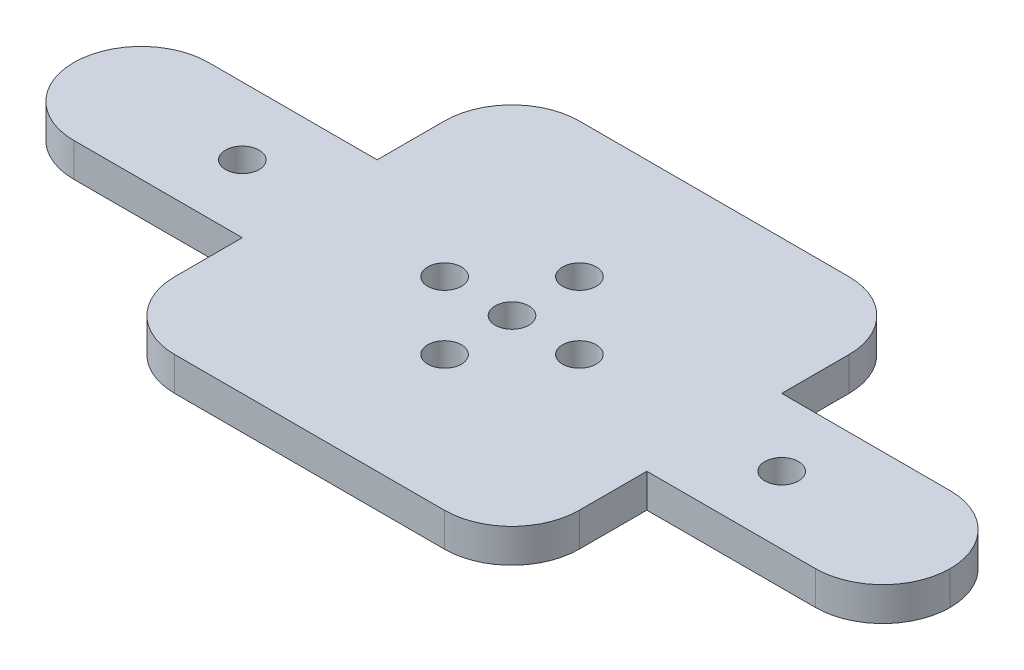
ISO-10303-21;
HEADER;
FILE_DESCRIPTION(('STEP AP214'),'2;1');
FILE_NAME('part.step','',(''),(''),'','','');
FILE_SCHEMA(('AUTOMOTIVE_DESIGN { 1 0 10303 214 1 1 1 1 }'));
ENDSEC;
DATA;
#1=APPLICATION_CONTEXT('core data for automotive mechanical design processes');
#2=APPLICATION_PROTOCOL_DEFINITION('international standard','automotive_design',2000,#1);
#3=PRODUCT_CONTEXT('',#1,'mechanical');
#4=PRODUCT('Part','Part','',(#3));
#5=PRODUCT_RELATED_PRODUCT_CATEGORY('part','',(#4));
#6=PRODUCT_DEFINITION_FORMATION('','',#4);
#7=PRODUCT_DEFINITION_CONTEXT('part definition',#1,'design');
#8=PRODUCT_DEFINITION('design','',#6,#7);
#9=PRODUCT_DEFINITION_SHAPE('','',#8);
#10=(LENGTH_UNIT() NAMED_UNIT(*) SI_UNIT(.MILLI.,.METRE.));
#11=(NAMED_UNIT(*) PLANE_ANGLE_UNIT() SI_UNIT($,.RADIAN.));
#12=(NAMED_UNIT(*) SI_UNIT($,.STERADIAN.) SOLID_ANGLE_UNIT());
#13=UNCERTAINTY_MEASURE_WITH_UNIT(LENGTH_MEASURE(1.E-05),#10,'distance_accuracy_value','');
#14=(GEOMETRIC_REPRESENTATION_CONTEXT(3) GLOBAL_UNCERTAINTY_ASSIGNED_CONTEXT((#13)) GLOBAL_UNIT_ASSIGNED_CONTEXT((#10,
#11,#12)) REPRESENTATION_CONTEXT('',''));
#15=CARTESIAN_POINT('',(0.,0.,0.));
#16=DIRECTION('',(0.,0.,1.));
#17=DIRECTION('',(1.,0.,0.));
#18=AXIS2_PLACEMENT_3D('',#15,#16,#17);
#19=CARTESIAN_POINT('',(0.,5.,0.));
#20=DIRECTION('',(1.,0.,0.));
#21=DIRECTION('',(0.,0.,-1.));
#22=AXIS2_PLACEMENT_3D('',#19,#20,#21);
#23=PLANE('',#22);
#24=DIRECTION('',(0.,0.,1.));
#25=VECTOR('',#24,1.);
#26=CARTESIAN_POINT('',(0.,5.,0.));
#27=LINE('',#26,#25);
#28=CARTESIAN_POINT('',(0.,5.,-50.));
#29=VERTEX_POINT('',#28);
#30=CARTESIAN_POINT('',(0.,5.,-40.0206914294047));
#31=VERTEX_POINT('',#30);
#32=EDGE_CURVE('E205',#29,#31,#27,.T.);
#33=ORIENTED_EDGE('',*,*,#32,.F.);
#34=DIRECTION('',(0.,-1.,0.));
#35=VECTOR('',#34,1.);
#36=CARTESIAN_POINT('',(0.,5.,-50.));
#37=LINE('',#36,#35);
#38=CARTESIAN_POINT('',(0.,0.,-50.));
#39=VERTEX_POINT('',#38);
#40=EDGE_CURVE('E11',#29,#39,#37,.T.);
#41=ORIENTED_EDGE('',*,*,#40,.T.);
#42=DIRECTION('',(0.,0.,1.));
#43=VECTOR('',#42,1.);
#44=CARTESIAN_POINT('',(0.,0.,0.));
#45=LINE('',#44,#43);
#46=CARTESIAN_POINT('',(0.,0.,-40.0206914294047));
#47=VERTEX_POINT('',#46);
#48=EDGE_CURVE('E227',#39,#47,#45,.T.);
#49=ORIENTED_EDGE('',*,*,#48,.T.);
#50=DIRECTION('',(0.,-1.,0.));
#51=VECTOR('',#50,1.);
#52=CARTESIAN_POINT('',(0.,5.,-40.0206914294047));
#53=LINE('',#52,#51);
#54=EDGE_CURVE('E199',#31,#47,#53,.T.);
#55=ORIENTED_EDGE('',*,*,#54,.F.);
#56=EDGE_LOOP('',(#33,#41,#49,#55));
#57=FACE_BOUND('',#56,.T.);
#58=ADVANCED_FACE('F45',(#57),#23,.F.);
#59=CARTESIAN_POINT('',(60.,5.,0.));
#60=DIRECTION('',(-1.,0.,0.));
#61=DIRECTION('',(0.,0.,1.));
#62=AXIS2_PLACEMENT_3D('',#59,#60,#61);
#63=PLANE('',#62);
#64=DIRECTION('',(0.,0.,-1.));
#65=VECTOR('',#64,1.);
#66=CARTESIAN_POINT('',(60.,5.,0.));
#67=LINE('',#66,#65);
#68=CARTESIAN_POINT('',(60.,5.,-10.));
#69=VERTEX_POINT('',#68);
#70=CARTESIAN_POINT('',(60.,5.,-20.0206914294047));
#71=VERTEX_POINT('',#70);
#72=EDGE_CURVE('E220',#69,#71,#67,.T.);
#73=ORIENTED_EDGE('',*,*,#72,.F.);
#74=DIRECTION('',(0.,-1.,0.));
#75=VECTOR('',#74,1.);
#76=CARTESIAN_POINT('',(60.,5.,-10.));
#77=LINE('',#76,#75);
#78=CARTESIAN_POINT('',(60.,0.,-10.));
#79=VERTEX_POINT('',#78);
#80=EDGE_CURVE('E279',#69,#79,#77,.T.);
#81=ORIENTED_EDGE('',*,*,#80,.T.);
#82=DIRECTION('',(0.,0.,-1.));
#83=VECTOR('',#82,1.);
#84=CARTESIAN_POINT('',(60.,0.,0.));
#85=LINE('',#84,#83);
#86=CARTESIAN_POINT('',(60.,0.,-20.0206914294047));
#87=VERTEX_POINT('',#86);
#88=EDGE_CURVE('E211',#79,#87,#85,.T.);
#89=ORIENTED_EDGE('',*,*,#88,.T.);
#90=DIRECTION('',(0.,-1.,0.));
#91=VECTOR('',#90,1.);
#92=CARTESIAN_POINT('',(60.,5.,-20.0206914294047));
#93=LINE('',#92,#91);
#94=EDGE_CURVE('E371',#71,#87,#93,.T.);
#95=ORIENTED_EDGE('',*,*,#94,.F.);
#96=EDGE_LOOP('',(#73,#81,#89,#95));
#97=FACE_BOUND('',#96,.T.);
#98=ADVANCED_FACE('F446',(#97),#63,.F.);
#99=CARTESIAN_POINT('',(0.,5.,0.));
#100=DIRECTION('',(0.,-1.,0.));
#101=DIRECTION('',(0.,0.,-1.));
#102=AXIS2_PLACEMENT_3D('',#99,#100,#101);
#103=PLANE('',#102);
#104=CARTESIAN_POINT('',(70.,5.,-30.0206914294047));
#105=DIRECTION('',(0.,1.,0.));
#106=DIRECTION('',(0.,0.,1.));
#107=AXIS2_PLACEMENT_3D('',#104,#105,#106);
#108=CIRCLE('',#107,2.50000000000001);
#109=CARTESIAN_POINT('',(70.,5.,-27.5206914294047));
#110=VERTEX_POINT('',#109);
#111=EDGE_CURVE('E376',#110,#110,#108,.T.);
#112=ORIENTED_EDGE('',*,*,#111,.F.);
#113=EDGE_LOOP('',(#112));
#114=FACE_BOUND('',#113,.T.);
#115=CARTESIAN_POINT('',(-10.,5.,-30.0206914294047));
#116=DIRECTION('',(0.,1.,0.));
#117=DIRECTION('',(0.,0.,1.));
#118=AXIS2_PLACEMENT_3D('',#115,#116,#117);
#119=CIRCLE('',#118,2.5);
#120=CARTESIAN_POINT('',(-10.,5.,-27.5206914294047));
#121=VERTEX_POINT('',#120);
#122=EDGE_CURVE('E261',#121,#121,#119,.T.);
#123=ORIENTED_EDGE('',*,*,#122,.F.);
#124=EDGE_LOOP('',(#123));
#125=FACE_BOUND('',#124,.T.);
#126=DIRECTION('',(1.,0.,0.));
#127=VECTOR('',#126,1.);
#128=CARTESIAN_POINT('',(0.,5.,0.));
#129=LINE('',#128,#127);
#130=CARTESIAN_POINT('',(10.,5.,0.));
#131=VERTEX_POINT('',#130);
#132=CARTESIAN_POINT('',(50.,5.,0.));
#133=VERTEX_POINT('',#132);
#134=EDGE_CURVE('E210',#131,#133,#129,.T.);
#135=ORIENTED_EDGE('',*,*,#134,.T.);
#136=CARTESIAN_POINT('',(50.,5.,-10.));
#137=DIRECTION('',(0.,-1.,0.));
#138=DIRECTION('',(0.,0.,-1.));
#139=AXIS2_PLACEMENT_3D('',#136,#137,#138);
#140=CIRCLE('',#139,10.);
#141=EDGE_CURVE('E313',#133,#69,#140,.F.);
#142=ORIENTED_EDGE('',*,*,#141,.T.);
#143=ORIENTED_EDGE('',*,*,#72,.T.);
#144=DIRECTION('',(1.,0.,0.));
#145=VECTOR('',#144,1.);
#146=CARTESIAN_POINT('',(60.,5.,-20.0206914294047));
#147=LINE('',#146,#145);
#148=CARTESIAN_POINT('',(85.,5.,-20.0206914294047));
#149=VERTEX_POINT('',#148);
#150=EDGE_CURVE('E382',#71,#149,#147,.T.);
#151=ORIENTED_EDGE('',*,*,#150,.T.);
#152=CARTESIAN_POINT('',(85.,5.,-30.0206914294047));
#153=DIRECTION('',(0.,-1.,0.));
#154=DIRECTION('',(0.,0.,-1.));
#155=AXIS2_PLACEMENT_3D('',#152,#153,#154);
#156=CIRCLE('',#155,10.);
#157=CARTESIAN_POINT('',(95.,5.,-30.0206914294047));
#158=VERTEX_POINT('',#157);
#159=EDGE_CURVE('E250',#149,#158,#156,.F.);
#160=ORIENTED_EDGE('',*,*,#159,.T.);
#161=CARTESIAN_POINT('',(85.,5.,-30.0206914294047));
#162=DIRECTION('',(0.,-1.,0.));
#163=DIRECTION('',(0.,0.,-1.));
#164=AXIS2_PLACEMENT_3D('',#161,#162,#163);
#165=CIRCLE('',#164,10.);
#166=CARTESIAN_POINT('',(85.,5.,-40.0206914294047));
#167=VERTEX_POINT('',#166);
#168=EDGE_CURVE('E247',#158,#167,#165,.F.);
#169=ORIENTED_EDGE('',*,*,#168,.T.);
#170=DIRECTION('',(-1.,0.,0.));
#171=VECTOR('',#170,1.);
#172=CARTESIAN_POINT('',(60.,5.,-40.0206914294047));
#173=LINE('',#172,#171);
#174=CARTESIAN_POINT('',(60.,5.,-40.0206914294047));
#175=VERTEX_POINT('',#174);
#176=EDGE_CURVE('E335',#167,#175,#173,.T.);
#177=ORIENTED_EDGE('',*,*,#176,.T.);
#178=CARTESIAN_POINT('',(60.,5.,-50.));
#179=VERTEX_POINT('',#178);
#180=EDGE_CURVE('E219',#175,#179,#67,.T.);
#181=ORIENTED_EDGE('',*,*,#180,.T.);
#182=CARTESIAN_POINT('',(50.,5.,-50.));
#183=DIRECTION('',(0.,-1.,0.));
#184=DIRECTION('',(0.,0.,-1.));
#185=AXIS2_PLACEMENT_3D('',#182,#183,#184);
#186=CIRCLE('',#185,10.);
#187=CARTESIAN_POINT('',(50.,5.,-60.));
#188=VERTEX_POINT('',#187);
#189=EDGE_CURVE('E307',#179,#188,#186,.F.);
#190=ORIENTED_EDGE('',*,*,#189,.T.);
#191=DIRECTION('',(-1.,0.,0.));
#192=VECTOR('',#191,1.);
#193=CARTESIAN_POINT('',(0.,5.,-60.));
#194=LINE('',#193,#192);
#195=CARTESIAN_POINT('',(10.,5.,-60.));
#196=VERTEX_POINT('',#195);
#197=EDGE_CURVE('E223',#188,#196,#194,.T.);
#198=ORIENTED_EDGE('',*,*,#197,.T.);
#199=CARTESIAN_POINT('',(10.,5.,-50.));
#200=DIRECTION('',(0.,-1.,0.));
#201=DIRECTION('',(0.,0.,-1.));
#202=AXIS2_PLACEMENT_3D('',#199,#200,#201);
#203=CIRCLE('',#202,10.);
#204=EDGE_CURVE('E61',#196,#29,#203,.F.);
#205=ORIENTED_EDGE('',*,*,#204,.T.);
#206=ORIENTED_EDGE('',*,*,#32,.T.);
#207=DIRECTION('',(-1.,0.,0.));
#208=VECTOR('',#207,1.);
#209=CARTESIAN_POINT('',(0.,5.,-40.0206914294047));
#210=LINE('',#209,#208);
#211=CARTESIAN_POINT('',(-25.,5.,-40.0206914294047));
#212=VERTEX_POINT('',#211);
#213=EDGE_CURVE('E186',#31,#212,#210,.T.);
#214=ORIENTED_EDGE('',*,*,#213,.T.);
#215=CARTESIAN_POINT('',(-25.,5.,-30.0206914294047));
#216=DIRECTION('',(0.,-1.,0.));
#217=DIRECTION('',(0.,0.,-1.));
#218=AXIS2_PLACEMENT_3D('',#215,#216,#217);
#219=CIRCLE('',#218,10.);
#220=CARTESIAN_POINT('',(-35.,5.,-30.0206914294047));
#221=VERTEX_POINT('',#220);
#222=EDGE_CURVE('E271',#212,#221,#219,.F.);
#223=ORIENTED_EDGE('',*,*,#222,.T.);
#224=CARTESIAN_POINT('',(-25.,5.,-30.0206914294047));
#225=DIRECTION('',(0.,-1.,0.));
#226=DIRECTION('',(0.,0.,-1.));
#227=AXIS2_PLACEMENT_3D('',#224,#225,#226);
#228=CIRCLE('',#227,10.);
#229=CARTESIAN_POINT('',(-25.,5.,-20.0206914294047));
#230=VERTEX_POINT('',#229);
#231=EDGE_CURVE('E181',#221,#230,#228,.F.);
#232=ORIENTED_EDGE('',*,*,#231,.T.);
#233=DIRECTION('',(1.,0.,0.));
#234=VECTOR('',#233,1.);
#235=CARTESIAN_POINT('',(0.,5.,-20.0206914294047));
#236=LINE('',#235,#234);
#237=CARTESIAN_POINT('',(0.,5.,-20.0206914294047));
#238=VERTEX_POINT('',#237);
#239=EDGE_CURVE('E172',#230,#238,#236,.T.);
#240=ORIENTED_EDGE('',*,*,#239,.T.);
#241=CARTESIAN_POINT('',(0.,5.,-10.));
#242=VERTEX_POINT('',#241);
#243=EDGE_CURVE('E178',#238,#242,#27,.T.);
#244=ORIENTED_EDGE('',*,*,#243,.T.);
#245=CARTESIAN_POINT('',(10.,5.,-10.));
#246=DIRECTION('',(0.,-1.,0.));
#247=DIRECTION('',(0.,0.,-1.));
#248=AXIS2_PLACEMENT_3D('',#245,#246,#247);
#249=CIRCLE('',#248,10.);
#250=EDGE_CURVE('E310',#242,#131,#249,.F.);
#251=ORIENTED_EDGE('',*,*,#250,.T.);
#252=EDGE_LOOP('',(#135,#142,#143,#151,#160,#169,#177,#181,#190,#198,#205,#206,#214,#223,#232,
#240,#244,#251));
#253=FACE_BOUND('',#252,.T.);
#254=CARTESIAN_POINT('',(30.,5.,-40.0206914294047));
#255=DIRECTION('',(0.,1.,0.));
#256=DIRECTION('',(0.,0.,1.));
#257=AXIS2_PLACEMENT_3D('',#254,#255,#256);
#258=CIRCLE('',#257,2.5);
#259=CARTESIAN_POINT('',(30.,5.,-37.5206914294047));
#260=VERTEX_POINT('',#259);
#261=EDGE_CURVE('E421',#260,#260,#258,.T.);
#262=ORIENTED_EDGE('',*,*,#261,.F.);
#263=EDGE_LOOP('',(#262));
#264=FACE_BOUND('',#263,.T.);
#265=CARTESIAN_POINT('',(20.,5.,-30.0206914294047));
#266=DIRECTION('',(0.,1.,0.));
#267=DIRECTION('',(0.,0.,1.));
#268=AXIS2_PLACEMENT_3D('',#265,#266,#267);
#269=CIRCLE('',#268,2.5);
#270=CARTESIAN_POINT('',(20.,5.,-27.5206914294047));
#271=VERTEX_POINT('',#270);
#272=EDGE_CURVE('E415',#271,#271,#269,.T.);
#273=ORIENTED_EDGE('',*,*,#272,.F.);
#274=EDGE_LOOP('',(#273));
#275=FACE_BOUND('',#274,.T.);
#276=CARTESIAN_POINT('',(30.,5.,-20.0206914294047));
#277=DIRECTION('',(0.,1.,0.));
#278=DIRECTION('',(0.,0.,1.));
#279=AXIS2_PLACEMENT_3D('',#276,#277,#278);
#280=CIRCLE('',#279,2.5);
#281=CARTESIAN_POINT('',(30.,5.,-17.5206914294047));
#282=VERTEX_POINT('',#281);
#283=EDGE_CURVE('E407',#282,#282,#280,.T.);
#284=ORIENTED_EDGE('',*,*,#283,.F.);
#285=EDGE_LOOP('',(#284));
#286=FACE_BOUND('',#285,.T.);
#287=CARTESIAN_POINT('',(40.,5.,-30.0206914294047));
#288=DIRECTION('',(0.,1.,0.));
#289=DIRECTION('',(0.,0.,1.));
#290=AXIS2_PLACEMENT_3D('',#287,#288,#289);
#291=CIRCLE('',#290,2.5);
#292=CARTESIAN_POINT('',(40.,5.,-27.5206914294047));
#293=VERTEX_POINT('',#292);
#294=EDGE_CURVE('E399',#293,#293,#291,.T.);
#295=ORIENTED_EDGE('',*,*,#294,.F.);
#296=EDGE_LOOP('',(#295));
#297=FACE_BOUND('',#296,.T.);
#298=CARTESIAN_POINT('',(30.,5.,-30.0206914294047));
#299=DIRECTION('',(0.,1.,0.));
#300=DIRECTION('',(0.,0.,1.));
#301=AXIS2_PLACEMENT_3D('',#298,#299,#300);
#302=CIRCLE('',#301,2.5);
#303=CARTESIAN_POINT('',(30.,5.,-27.5206914294047));
#304=VERTEX_POINT('',#303);
#305=EDGE_CURVE('E391',#304,#304,#302,.T.);
#306=ORIENTED_EDGE('',*,*,#305,.F.);
#307=EDGE_LOOP('',(#306));
#308=FACE_BOUND('',#307,.T.);
#309=ADVANCED_FACE('F175',(#114,#125,#253,#264,#275,#286,#297,#308),#103,.F.);
#310=CARTESIAN_POINT('',(0.,0.,0.));
#311=DIRECTION('',(0.,-1.,0.));
#312=DIRECTION('',(0.,0.,-1.));
#313=AXIS2_PLACEMENT_3D('',#310,#311,#312);
#314=PLANE('',#313);
#315=CARTESIAN_POINT('',(70.,0.,-30.0206914294047));
#316=DIRECTION('',(0.,1.,0.));
#317=DIRECTION('',(0.,0.,1.));
#318=AXIS2_PLACEMENT_3D('',#315,#316,#317);
#319=CIRCLE('',#318,2.50000000000001);
#320=CARTESIAN_POINT('',(70.,0.,-27.5206914294047));
#321=VERTEX_POINT('',#320);
#322=EDGE_CURVE('E737',#321,#321,#319,.T.);
#323=ORIENTED_EDGE('',*,*,#322,.T.);
#324=EDGE_LOOP('',(#323));
#325=FACE_BOUND('',#324,.T.);
#326=CARTESIAN_POINT('',(-10.,0.,-30.0206914294047));
#327=DIRECTION('',(0.,1.,0.));
#328=DIRECTION('',(0.,0.,1.));
#329=AXIS2_PLACEMENT_3D('',#326,#327,#328);
#330=CIRCLE('',#329,2.5);
#331=CARTESIAN_POINT('',(-10.,0.,-27.5206914294047));
#332=VERTEX_POINT('',#331);
#333=EDGE_CURVE('E735',#332,#332,#330,.T.);
#334=ORIENTED_EDGE('',*,*,#333,.T.);
#335=EDGE_LOOP('',(#334));
#336=FACE_BOUND('',#335,.T.);
#337=CARTESIAN_POINT('',(40.,0.,-30.0206914294047));
#338=DIRECTION('',(0.,1.,0.));
#339=DIRECTION('',(0.,0.,1.));
#340=AXIS2_PLACEMENT_3D('',#337,#338,#339);
#341=CIRCLE('',#340,2.5);
#342=CARTESIAN_POINT('',(40.,0.,-27.5206914294047));
#343=VERTEX_POINT('',#342);
#344=EDGE_CURVE('E395',#343,#343,#341,.T.);
#345=ORIENTED_EDGE('',*,*,#344,.T.);
#346=EDGE_LOOP('',(#345));
#347=FACE_BOUND('',#346,.T.);
#348=CARTESIAN_POINT('',(20.,0.,-30.0206914294047));
#349=DIRECTION('',(0.,1.,0.));
#350=DIRECTION('',(0.,0.,1.));
#351=AXIS2_PLACEMENT_3D('',#348,#349,#350);
#352=CIRCLE('',#351,2.5);
#353=CARTESIAN_POINT('',(20.,0.,-27.5206914294047));
#354=VERTEX_POINT('',#353);
#355=EDGE_CURVE('E411',#354,#354,#352,.T.);
#356=ORIENTED_EDGE('',*,*,#355,.T.);
#357=EDGE_LOOP('',(#356));
#358=FACE_BOUND('',#357,.T.);
#359=ORIENTED_EDGE('',*,*,#88,.F.);
#360=CARTESIAN_POINT('',(50.,0.,-10.));
#361=DIRECTION('',(0.,-1.,0.));
#362=DIRECTION('',(0.,0.,-1.));
#363=AXIS2_PLACEMENT_3D('',#360,#361,#362);
#364=CIRCLE('',#363,10.);
#365=CARTESIAN_POINT('',(50.,0.,0.));
#366=VERTEX_POINT('',#365);
#367=EDGE_CURVE('E295',#79,#366,#364,.T.);
#368=ORIENTED_EDGE('',*,*,#367,.T.);
#369=DIRECTION('',(1.,0.,0.));
#370=VECTOR('',#369,1.);
#371=CARTESIAN_POINT('',(0.,0.,0.));
#372=LINE('',#371,#370);
#373=CARTESIAN_POINT('',(10.,0.,0.));
#374=VERTEX_POINT('',#373);
#375=EDGE_CURVE('E230',#374,#366,#372,.T.);
#376=ORIENTED_EDGE('',*,*,#375,.F.);
#377=CARTESIAN_POINT('',(10.,0.,-10.));
#378=DIRECTION('',(0.,-1.,0.));
#379=DIRECTION('',(0.,0.,-1.));
#380=AXIS2_PLACEMENT_3D('',#377,#378,#379);
#381=CIRCLE('',#380,10.);
#382=CARTESIAN_POINT('',(0.,0.,-10.));
#383=VERTEX_POINT('',#382);
#384=EDGE_CURVE('E292',#374,#383,#381,.T.);
#385=ORIENTED_EDGE('',*,*,#384,.T.);
#386=CARTESIAN_POINT('',(0.,0.,-20.0206914294047));
#387=VERTEX_POINT('',#386);
#388=EDGE_CURVE('E231',#387,#383,#45,.T.);
#389=ORIENTED_EDGE('',*,*,#388,.F.);
#390=DIRECTION('',(1.,0.,0.));
#391=VECTOR('',#390,1.);
#392=CARTESIAN_POINT('',(0.,0.,-20.0206914294047));
#393=LINE('',#392,#391);
#394=CARTESIAN_POINT('',(-25.,0.,-20.0206914294047));
#395=VERTEX_POINT('',#394);
#396=EDGE_CURVE('E193',#395,#387,#393,.T.);
#397=ORIENTED_EDGE('',*,*,#396,.F.);
#398=CARTESIAN_POINT('',(-25.,0.,-30.0206914294047));
#399=DIRECTION('',(0.,-1.,0.));
#400=DIRECTION('',(0.,0.,-1.));
#401=AXIS2_PLACEMENT_3D('',#398,#399,#400);
#402=CIRCLE('',#401,10.);
#403=CARTESIAN_POINT('',(-35.,0.,-30.0206914294047));
#404=VERTEX_POINT('',#403);
#405=EDGE_CURVE('E268',#395,#404,#402,.T.);
#406=ORIENTED_EDGE('',*,*,#405,.T.);
#407=CARTESIAN_POINT('',(-25.,0.,-30.0206914294047));
#408=DIRECTION('',(0.,-1.,0.));
#409=DIRECTION('',(0.,0.,-1.));
#410=AXIS2_PLACEMENT_3D('',#407,#408,#409);
#411=CIRCLE('',#410,10.);
#412=CARTESIAN_POINT('',(-25.,0.,-40.0206914294047));
#413=VERTEX_POINT('',#412);
#414=EDGE_CURVE('E265',#404,#413,#411,.T.);
#415=ORIENTED_EDGE('',*,*,#414,.T.);
#416=DIRECTION('',(-1.,0.,0.));
#417=VECTOR('',#416,1.);
#418=CARTESIAN_POINT('',(0.,0.,-40.0206914294047));
#419=LINE('',#418,#417);
#420=EDGE_CURVE('E187',#47,#413,#419,.T.);
#421=ORIENTED_EDGE('',*,*,#420,.F.);
#422=ORIENTED_EDGE('',*,*,#48,.F.);
#423=CARTESIAN_POINT('',(10.,0.,-50.));
#424=DIRECTION('',(0.,-1.,0.));
#425=DIRECTION('',(0.,0.,-1.));
#426=AXIS2_PLACEMENT_3D('',#423,#424,#425);
#427=CIRCLE('',#426,10.);
#428=CARTESIAN_POINT('',(10.,0.,-60.));
#429=VERTEX_POINT('',#428);
#430=EDGE_CURVE('E286',#39,#429,#427,.T.);
#431=ORIENTED_EDGE('',*,*,#430,.T.);
#432=DIRECTION('',(-1.,0.,0.));
#433=VECTOR('',#432,1.);
#434=CARTESIAN_POINT('',(0.,0.,-60.));
#435=LINE('',#434,#433);
#436=CARTESIAN_POINT('',(50.,0.,-60.));
#437=VERTEX_POINT('',#436);
#438=EDGE_CURVE('E206',#437,#429,#435,.T.);
#439=ORIENTED_EDGE('',*,*,#438,.F.);
#440=CARTESIAN_POINT('',(50.,0.,-50.));
#441=DIRECTION('',(0.,-1.,0.));
#442=DIRECTION('',(0.,0.,-1.));
#443=AXIS2_PLACEMENT_3D('',#440,#441,#442);
#444=CIRCLE('',#443,10.);
#445=CARTESIAN_POINT('',(60.,0.,-50.));
#446=VERTEX_POINT('',#445);
#447=EDGE_CURVE('E289',#437,#446,#444,.T.);
#448=ORIENTED_EDGE('',*,*,#447,.T.);
#449=CARTESIAN_POINT('',(60.,0.,-40.0206914294047));
#450=VERTEX_POINT('',#449);
#451=EDGE_CURVE('E235',#450,#446,#85,.T.);
#452=ORIENTED_EDGE('',*,*,#451,.F.);
#453=DIRECTION('',(-1.,0.,0.));
#454=VECTOR('',#453,1.);
#455=CARTESIAN_POINT('',(60.,0.,-40.0206914294047));
#456=LINE('',#455,#454);
#457=CARTESIAN_POINT('',(85.,0.,-40.0206914294047));
#458=VERTEX_POINT('',#457);
#459=EDGE_CURVE('E379',#458,#450,#456,.T.);
#460=ORIENTED_EDGE('',*,*,#459,.F.);
#461=CARTESIAN_POINT('',(85.,0.,-30.0206914294047));
#462=DIRECTION('',(0.,-1.,0.));
#463=DIRECTION('',(0.,0.,-1.));
#464=AXIS2_PLACEMENT_3D('',#461,#462,#463);
#465=CIRCLE('',#464,10.);
#466=CARTESIAN_POINT('',(95.,0.,-30.0206914294047));
#467=VERTEX_POINT('',#466);
#468=EDGE_CURVE('E226',#458,#467,#465,.T.);
#469=ORIENTED_EDGE('',*,*,#468,.T.);
#470=CARTESIAN_POINT('',(85.,0.,-30.0206914294047));
#471=DIRECTION('',(0.,-1.,0.));
#472=DIRECTION('',(0.,0.,-1.));
#473=AXIS2_PLACEMENT_3D('',#470,#471,#472);
#474=CIRCLE('',#473,10.);
#475=CARTESIAN_POINT('',(85.,0.,-20.0206914294047));
#476=VERTEX_POINT('',#475);
#477=EDGE_CURVE('E240',#467,#476,#474,.T.);
#478=ORIENTED_EDGE('',*,*,#477,.T.);
#479=DIRECTION('',(1.,0.,0.));
#480=VECTOR('',#479,1.);
#481=CARTESIAN_POINT('',(60.,0.,-20.0206914294047));
#482=LINE('',#481,#480);
#483=EDGE_CURVE('E368',#87,#476,#482,.T.);
#484=ORIENTED_EDGE('',*,*,#483,.F.);
#485=EDGE_LOOP('',(#359,#368,#376,#385,#389,#397,#406,#415,#421,#422,#431,#439,#448,#452,#460,
#469,#478,#484));
#486=FACE_BOUND('',#485,.T.);
#487=CARTESIAN_POINT('',(30.,0.,-40.0206914294047));
#488=DIRECTION('',(0.,1.,0.));
#489=DIRECTION('',(0.,0.,1.));
#490=AXIS2_PLACEMENT_3D('',#487,#488,#489);
#491=CIRCLE('',#490,2.5);
#492=CARTESIAN_POINT('',(30.,0.,-37.5206914294047));
#493=VERTEX_POINT('',#492);
#494=EDGE_CURVE('E215',#493,#493,#491,.T.);
#495=ORIENTED_EDGE('',*,*,#494,.T.);
#496=EDGE_LOOP('',(#495));
#497=FACE_BOUND('',#496,.T.);
#498=CARTESIAN_POINT('',(30.,0.,-20.0206914294047));
#499=DIRECTION('',(0.,1.,0.));
#500=DIRECTION('',(0.,0.,1.));
#501=AXIS2_PLACEMENT_3D('',#498,#499,#500);
#502=CIRCLE('',#501,2.5);
#503=CARTESIAN_POINT('',(30.,0.,-17.5206914294047));
#504=VERTEX_POINT('',#503);
#505=EDGE_CURVE('E403',#504,#504,#502,.T.);
#506=ORIENTED_EDGE('',*,*,#505,.T.);
#507=EDGE_LOOP('',(#506));
#508=FACE_BOUND('',#507,.T.);
#509=CARTESIAN_POINT('',(30.,0.,-30.0206914294047));
#510=DIRECTION('',(0.,1.,0.));
#511=DIRECTION('',(0.,0.,1.));
#512=AXIS2_PLACEMENT_3D('',#509,#510,#511);
#513=CIRCLE('',#512,2.5);
#514=CARTESIAN_POINT('',(30.,0.,-27.5206914294047));
#515=VERTEX_POINT('',#514);
#516=EDGE_CURVE('E198',#515,#515,#513,.T.);
#517=ORIENTED_EDGE('',*,*,#516,.T.);
#518=EDGE_LOOP('',(#517));
#519=FACE_BOUND('',#518,.T.);
#520=ADVANCED_FACE('F344',(#325,#336,#347,#358,#486,#497,#508,#519),#314,.T.);
#521=ORIENTED_EDGE('',*,*,#388,.T.);
#522=DIRECTION('',(0.,-1.,0.));
#523=VECTOR('',#522,1.);
#524=CARTESIAN_POINT('',(0.,5.,-10.));
#525=LINE('',#524,#523);
#526=EDGE_CURVE('E203',#383,#242,#525,.F.);
#527=ORIENTED_EDGE('',*,*,#526,.T.);
#528=ORIENTED_EDGE('',*,*,#243,.F.);
#529=DIRECTION('',(0.,-1.,0.));
#530=VECTOR('',#529,1.);
#531=CARTESIAN_POINT('',(0.,5.,-20.0206914294047));
#532=LINE('',#531,#530);
#533=EDGE_CURVE('E190',#238,#387,#532,.T.);
#534=ORIENTED_EDGE('',*,*,#533,.T.);
#535=EDGE_LOOP('',(#521,#527,#528,#534));
#536=FACE_BOUND('',#535,.T.);
#537=ADVANCED_FACE('F201',(#536),#23,.F.);
#538=CARTESIAN_POINT('',(0.,5.,0.));
#539=DIRECTION('',(0.,0.,-1.));
#540=DIRECTION('',(-1.,0.,0.));
#541=AXIS2_PLACEMENT_3D('',#538,#539,#540);
#542=PLANE('',#541);
#543=ORIENTED_EDGE('',*,*,#375,.T.);
#544=DIRECTION('',(0.,-1.,0.));
#545=VECTOR('',#544,1.);
#546=CARTESIAN_POINT('',(50.,5.,0.));
#547=LINE('',#546,#545);
#548=EDGE_CURVE('E302',#366,#133,#547,.F.);
#549=ORIENTED_EDGE('',*,*,#548,.T.);
#550=ORIENTED_EDGE('',*,*,#134,.F.);
#551=DIRECTION('',(0.,-1.,0.));
#552=VECTOR('',#551,1.);
#553=CARTESIAN_POINT('',(10.,5.,0.));
#554=LINE('',#553,#552);
#555=EDGE_CURVE('E298',#131,#374,#554,.T.);
#556=ORIENTED_EDGE('',*,*,#555,.T.);
#557=EDGE_LOOP('',(#543,#549,#550,#556));
#558=FACE_BOUND('',#557,.T.);
#559=ADVANCED_FACE('F457',(#558),#542,.F.);
#560=ORIENTED_EDGE('',*,*,#451,.T.);
#561=DIRECTION('',(0.,-1.,0.));
#562=VECTOR('',#561,1.);
#563=CARTESIAN_POINT('',(60.,5.,-50.));
#564=LINE('',#563,#562);
#565=EDGE_CURVE('E54',#446,#179,#564,.F.);
#566=ORIENTED_EDGE('',*,*,#565,.T.);
#567=ORIENTED_EDGE('',*,*,#180,.F.);
#568=DIRECTION('',(0.,-1.,0.));
#569=VECTOR('',#568,1.);
#570=CARTESIAN_POINT('',(60.,5.,-40.0206914294047));
#571=LINE('',#570,#569);
#572=EDGE_CURVE('E375',#175,#450,#571,.T.);
#573=ORIENTED_EDGE('',*,*,#572,.T.);
#574=EDGE_LOOP('',(#560,#566,#567,#573));
#575=FACE_BOUND('',#574,.T.);
#576=ADVANCED_FACE('F329',(#575),#63,.F.);
#577=CARTESIAN_POINT('',(0.,5.,-60.));
#578=DIRECTION('',(0.,0.,1.));
#579=DIRECTION('',(1.,0.,0.));
#580=AXIS2_PLACEMENT_3D('',#577,#578,#579);
#581=PLANE('',#580);
#582=ORIENTED_EDGE('',*,*,#197,.F.);
#583=DIRECTION('',(0.,-1.,0.));
#584=VECTOR('',#583,1.);
#585=CARTESIAN_POINT('',(50.,5.,-60.));
#586=LINE('',#585,#584);
#587=EDGE_CURVE('E320',#188,#437,#586,.T.);
#588=ORIENTED_EDGE('',*,*,#587,.T.);
#589=ORIENTED_EDGE('',*,*,#438,.T.);
#590=DIRECTION('',(0.,-1.,0.));
#591=VECTOR('',#590,1.);
#592=CARTESIAN_POINT('',(10.,5.,-60.));
#593=LINE('',#592,#591);
#594=EDGE_CURVE('E69',#429,#196,#593,.F.);
#595=ORIENTED_EDGE('',*,*,#594,.T.);
#596=EDGE_LOOP('',(#582,#588,#589,#595));
#597=FACE_BOUND('',#596,.T.);
#598=ADVANCED_FACE('F341',(#597),#581,.F.);
#599=CARTESIAN_POINT('',(30.,5.,-40.0206914294047));
#600=DIRECTION('',(0.,-1.,0.));
#601=DIRECTION('',(0.,0.,-1.));
#602=AXIS2_PLACEMENT_3D('',#599,#600,#601);
#603=CYLINDRICAL_SURFACE('',#602,2.5);
#604=ORIENTED_EDGE('',*,*,#261,.T.);
#605=EDGE_LOOP('',(#604));
#606=FACE_BOUND('',#605,.T.);
#607=ORIENTED_EDGE('',*,*,#494,.F.);
#608=EDGE_LOOP('',(#607));
#609=FACE_BOUND('',#608,.T.);
#610=ADVANCED_FACE('F432',(#606,#609),#603,.F.);
#611=CARTESIAN_POINT('',(20.,5.,-30.0206914294047));
#612=DIRECTION('',(0.,-1.,0.));
#613=DIRECTION('',(0.,0.,-1.));
#614=AXIS2_PLACEMENT_3D('',#611,#612,#613);
#615=CYLINDRICAL_SURFACE('',#614,2.5);
#616=ORIENTED_EDGE('',*,*,#272,.T.);
#617=EDGE_LOOP('',(#616));
#618=FACE_BOUND('',#617,.T.);
#619=ORIENTED_EDGE('',*,*,#355,.F.);
#620=EDGE_LOOP('',(#619));
#621=FACE_BOUND('',#620,.T.);
#622=ADVANCED_FACE('F434',(#618,#621),#615,.F.);
#623=CARTESIAN_POINT('',(30.,5.,-20.0206914294047));
#624=DIRECTION('',(0.,-1.,0.));
#625=DIRECTION('',(0.,0.,-1.));
#626=AXIS2_PLACEMENT_3D('',#623,#624,#625);
#627=CYLINDRICAL_SURFACE('',#626,2.5);
#628=ORIENTED_EDGE('',*,*,#283,.T.);
#629=EDGE_LOOP('',(#628));
#630=FACE_BOUND('',#629,.T.);
#631=ORIENTED_EDGE('',*,*,#505,.F.);
#632=EDGE_LOOP('',(#631));
#633=FACE_BOUND('',#632,.T.);
#634=ADVANCED_FACE('F439',(#630,#633),#627,.F.);
#635=CARTESIAN_POINT('',(40.,5.,-30.0206914294047));
#636=DIRECTION('',(0.,-1.,0.));
#637=DIRECTION('',(0.,0.,-1.));
#638=AXIS2_PLACEMENT_3D('',#635,#636,#637);
#639=CYLINDRICAL_SURFACE('',#638,2.5);
#640=ORIENTED_EDGE('',*,*,#294,.T.);
#641=EDGE_LOOP('',(#640));
#642=FACE_BOUND('',#641,.T.);
#643=ORIENTED_EDGE('',*,*,#344,.F.);
#644=EDGE_LOOP('',(#643));
#645=FACE_BOUND('',#644,.T.);
#646=ADVANCED_FACE('F618',(#642,#645),#639,.F.);
#647=CARTESIAN_POINT('',(30.,5.,-30.0206914294047));
#648=DIRECTION('',(0.,-1.,0.));
#649=DIRECTION('',(0.,0.,-1.));
#650=AXIS2_PLACEMENT_3D('',#647,#648,#649);
#651=CYLINDRICAL_SURFACE('',#650,2.5);
#652=ORIENTED_EDGE('',*,*,#305,.T.);
#653=EDGE_LOOP('',(#652));
#654=FACE_BOUND('',#653,.T.);
#655=ORIENTED_EDGE('',*,*,#516,.F.);
#656=EDGE_LOOP('',(#655));
#657=FACE_BOUND('',#656,.T.);
#658=ADVANCED_FACE('F599',(#654,#657),#651,.F.);
#659=CARTESIAN_POINT('',(60.,5.,-20.0206914294047));
#660=DIRECTION('',(0.,0.,-1.));
#661=DIRECTION('',(-1.,0.,0.));
#662=AXIS2_PLACEMENT_3D('',#659,#660,#661);
#663=PLANE('',#662);
#664=ORIENTED_EDGE('',*,*,#483,.T.);
#665=DIRECTION('',(0.,-1.,0.));
#666=VECTOR('',#665,1.);
#667=CARTESIAN_POINT('',(85.,5.,-20.0206914294047));
#668=LINE('',#667,#666);
#669=EDGE_CURVE('E243',#476,#149,#668,.F.);
#670=ORIENTED_EDGE('',*,*,#669,.T.);
#671=ORIENTED_EDGE('',*,*,#150,.F.);
#672=ORIENTED_EDGE('',*,*,#94,.T.);
#673=EDGE_LOOP('',(#664,#670,#671,#672));
#674=FACE_BOUND('',#673,.T.);
#675=ADVANCED_FACE('F590',(#674),#663,.F.);
#676=CARTESIAN_POINT('',(60.,5.,-40.0206914294047));
#677=DIRECTION('',(0.,0.,1.));
#678=DIRECTION('',(1.,0.,0.));
#679=AXIS2_PLACEMENT_3D('',#676,#677,#678);
#680=PLANE('',#679);
#681=ORIENTED_EDGE('',*,*,#176,.F.);
#682=DIRECTION('',(0.,-1.,0.));
#683=VECTOR('',#682,1.);
#684=CARTESIAN_POINT('',(85.,5.,-40.0206914294047));
#685=LINE('',#684,#683);
#686=EDGE_CURVE('E253',#167,#458,#685,.T.);
#687=ORIENTED_EDGE('',*,*,#686,.T.);
#688=ORIENTED_EDGE('',*,*,#459,.T.);
#689=ORIENTED_EDGE('',*,*,#572,.F.);
#690=EDGE_LOOP('',(#681,#687,#688,#689));
#691=FACE_BOUND('',#690,.T.);
#692=ADVANCED_FACE('F582',(#691),#680,.F.);
#693=CARTESIAN_POINT('',(0.,5.,-20.0206914294047));
#694=DIRECTION('',(0.,0.,-1.));
#695=DIRECTION('',(-1.,0.,0.));
#696=AXIS2_PLACEMENT_3D('',#693,#694,#695);
#697=PLANE('',#696);
#698=ORIENTED_EDGE('',*,*,#239,.F.);
#699=DIRECTION('',(0.,-1.,0.));
#700=VECTOR('',#699,1.);
#701=CARTESIAN_POINT('',(-25.,5.,-20.0206914294047));
#702=LINE('',#701,#700);
#703=EDGE_CURVE('E256',#230,#395,#702,.T.);
#704=ORIENTED_EDGE('',*,*,#703,.T.);
#705=ORIENTED_EDGE('',*,*,#396,.T.);
#706=ORIENTED_EDGE('',*,*,#533,.F.);
#707=EDGE_LOOP('',(#698,#704,#705,#706));
#708=FACE_BOUND('',#707,.T.);
#709=ADVANCED_FACE('F191',(#708),#697,.F.);
#710=CARTESIAN_POINT('',(0.,5.,-40.0206914294047));
#711=DIRECTION('',(0.,0.,1.));
#712=DIRECTION('',(1.,0.,0.));
#713=AXIS2_PLACEMENT_3D('',#710,#711,#712);
#714=PLANE('',#713);
#715=ORIENTED_EDGE('',*,*,#420,.T.);
#716=DIRECTION('',(0.,-1.,0.));
#717=VECTOR('',#716,1.);
#718=CARTESIAN_POINT('',(-25.,5.,-40.0206914294047));
#719=LINE('',#718,#717);
#720=EDGE_CURVE('E276',#413,#212,#719,.F.);
#721=ORIENTED_EDGE('',*,*,#720,.T.);
#722=ORIENTED_EDGE('',*,*,#213,.F.);
#723=ORIENTED_EDGE('',*,*,#54,.T.);
#724=EDGE_LOOP('',(#715,#721,#722,#723));
#725=FACE_BOUND('',#724,.T.);
#726=ADVANCED_FACE('F358',(#725),#714,.F.);
#727=CARTESIAN_POINT('',(-10.,5.,-30.0206914294047));
#728=DIRECTION('',(0.,-1.,0.));
#729=DIRECTION('',(0.,0.,-1.));
#730=AXIS2_PLACEMENT_3D('',#727,#728,#729);
#731=CYLINDRICAL_SURFACE('',#730,2.5);
#732=ORIENTED_EDGE('',*,*,#122,.T.);
#733=EDGE_LOOP('',(#732));
#734=FACE_BOUND('',#733,.T.);
#735=ORIENTED_EDGE('',*,*,#333,.F.);
#736=EDGE_LOOP('',(#735));
#737=FACE_BOUND('',#736,.T.);
#738=ADVANCED_FACE('F558',(#734,#737),#731,.F.);
#739=CARTESIAN_POINT('',(70.,5.,-30.0206914294047));
#740=DIRECTION('',(0.,-1.,0.));
#741=DIRECTION('',(0.,0.,-1.));
#742=AXIS2_PLACEMENT_3D('',#739,#740,#741);
#743=CYLINDRICAL_SURFACE('',#742,2.50000000000001);
#744=ORIENTED_EDGE('',*,*,#111,.T.);
#745=EDGE_LOOP('',(#744));
#746=FACE_BOUND('',#745,.T.);
#747=ORIENTED_EDGE('',*,*,#322,.F.);
#748=EDGE_LOOP('',(#747));
#749=FACE_BOUND('',#748,.T.);
#750=ADVANCED_FACE('F549',(#746,#749),#743,.F.);
#751=CARTESIAN_POINT('',(85.,5.,-30.0206914294047));
#752=DIRECTION('',(0.,-1.,0.));
#753=DIRECTION('',(0.,0.,-1.));
#754=AXIS2_PLACEMENT_3D('',#751,#752,#753);
#755=CYLINDRICAL_SURFACE('',#754,10.);
#756=ORIENTED_EDGE('',*,*,#686,.F.);
#757=ORIENTED_EDGE('',*,*,#168,.F.);
#758=DIRECTION('',(0.,-1.,0.));
#759=VECTOR('',#758,1.);
#760=CARTESIAN_POINT('',(95.,5.,-30.0206914294047));
#761=LINE('',#760,#759);
#762=EDGE_CURVE('E257',#467,#158,#761,.F.);
#763=ORIENTED_EDGE('',*,*,#762,.F.);
#764=ORIENTED_EDGE('',*,*,#468,.F.);
#765=EDGE_LOOP('',(#756,#757,#763,#764));
#766=FACE_BOUND('',#765,.T.);
#767=ADVANCED_FACE('F541',(#766),#755,.T.);
#768=CARTESIAN_POINT('',(85.,5.,-30.0206914294047));
#769=DIRECTION('',(0.,-1.,0.));
#770=DIRECTION('',(0.,0.,-1.));
#771=AXIS2_PLACEMENT_3D('',#768,#769,#770);
#772=CYLINDRICAL_SURFACE('',#771,10.);
#773=ORIENTED_EDGE('',*,*,#159,.F.);
#774=ORIENTED_EDGE('',*,*,#669,.F.);
#775=ORIENTED_EDGE('',*,*,#477,.F.);
#776=ORIENTED_EDGE('',*,*,#762,.T.);
#777=EDGE_LOOP('',(#773,#774,#775,#776));
#778=FACE_BOUND('',#777,.T.);
#779=ADVANCED_FACE('F532',(#778),#772,.T.);
#780=CARTESIAN_POINT('',(-25.,5.,-30.0206914294047));
#781=DIRECTION('',(0.,-1.,0.));
#782=DIRECTION('',(0.,0.,-1.));
#783=AXIS2_PLACEMENT_3D('',#780,#781,#782);
#784=CYLINDRICAL_SURFACE('',#783,10.);
#785=DIRECTION('',(0.,-1.,0.));
#786=VECTOR('',#785,1.);
#787=CARTESIAN_POINT('',(-35.,5.,-30.0206914294047));
#788=LINE('',#787,#786);
#789=EDGE_CURVE('E262',#221,#404,#788,.T.);
#790=ORIENTED_EDGE('',*,*,#789,.F.);
#791=ORIENTED_EDGE('',*,*,#222,.F.);
#792=ORIENTED_EDGE('',*,*,#720,.F.);
#793=ORIENTED_EDGE('',*,*,#414,.F.);
#794=EDGE_LOOP('',(#790,#791,#792,#793));
#795=FACE_BOUND('',#794,.T.);
#796=ADVANCED_FACE('F523',(#795),#784,.T.);
#797=CARTESIAN_POINT('',(-25.,5.,-30.0206914294047));
#798=DIRECTION('',(0.,-1.,0.));
#799=DIRECTION('',(0.,0.,-1.));
#800=AXIS2_PLACEMENT_3D('',#797,#798,#799);
#801=CYLINDRICAL_SURFACE('',#800,10.);
#802=ORIENTED_EDGE('',*,*,#231,.F.);
#803=ORIENTED_EDGE('',*,*,#789,.T.);
#804=ORIENTED_EDGE('',*,*,#405,.F.);
#805=ORIENTED_EDGE('',*,*,#703,.F.);
#806=EDGE_LOOP('',(#802,#803,#804,#805));
#807=FACE_BOUND('',#806,.T.);
#808=ADVANCED_FACE('F490',(#807),#801,.T.);
#809=CARTESIAN_POINT('',(50.,5.,-10.));
#810=DIRECTION('',(0.,-1.,0.));
#811=DIRECTION('',(0.,0.,-1.));
#812=AXIS2_PLACEMENT_3D('',#809,#810,#811);
#813=CYLINDRICAL_SURFACE('',#812,10.);
#814=ORIENTED_EDGE('',*,*,#141,.F.);
#815=ORIENTED_EDGE('',*,*,#548,.F.);
#816=ORIENTED_EDGE('',*,*,#367,.F.);
#817=ORIENTED_EDGE('',*,*,#80,.F.);
#818=EDGE_LOOP('',(#814,#815,#816,#817));
#819=FACE_BOUND('',#818,.T.);
#820=ADVANCED_FACE('F485',(#819),#813,.T.);
#821=CARTESIAN_POINT('',(10.,5.,-10.));
#822=DIRECTION('',(0.,-1.,0.));
#823=DIRECTION('',(0.,0.,-1.));
#824=AXIS2_PLACEMENT_3D('',#821,#822,#823);
#825=CYLINDRICAL_SURFACE('',#824,10.);
#826=ORIENTED_EDGE('',*,*,#250,.F.);
#827=ORIENTED_EDGE('',*,*,#526,.F.);
#828=ORIENTED_EDGE('',*,*,#384,.F.);
#829=ORIENTED_EDGE('',*,*,#555,.F.);
#830=EDGE_LOOP('',(#826,#827,#828,#829));
#831=FACE_BOUND('',#830,.T.);
#832=ADVANCED_FACE('F489',(#831),#825,.T.);
#833=CARTESIAN_POINT('',(50.,5.,-50.));
#834=DIRECTION('',(0.,-1.,0.));
#835=DIRECTION('',(0.,0.,-1.));
#836=AXIS2_PLACEMENT_3D('',#833,#834,#835);
#837=CYLINDRICAL_SURFACE('',#836,10.);
#838=ORIENTED_EDGE('',*,*,#189,.F.);
#839=ORIENTED_EDGE('',*,*,#565,.F.);
#840=ORIENTED_EDGE('',*,*,#447,.F.);
#841=ORIENTED_EDGE('',*,*,#587,.F.);
#842=EDGE_LOOP('',(#838,#839,#840,#841));
#843=FACE_BOUND('',#842,.T.);
#844=ADVANCED_FACE('F339',(#843),#837,.T.);
#845=CARTESIAN_POINT('',(10.,5.,-50.));
#846=DIRECTION('',(0.,-1.,0.));
#847=DIRECTION('',(0.,0.,-1.));
#848=AXIS2_PLACEMENT_3D('',#845,#846,#847);
#849=CYLINDRICAL_SURFACE('',#848,10.);
#850=ORIENTED_EDGE('',*,*,#204,.F.);
#851=ORIENTED_EDGE('',*,*,#594,.F.);
#852=ORIENTED_EDGE('',*,*,#430,.F.);
#853=ORIENTED_EDGE('',*,*,#40,.F.);
#854=EDGE_LOOP('',(#850,#851,#852,#853));
#855=FACE_BOUND('',#854,.T.);
#856=ADVANCED_FACE('F47',(#855),#849,.T.);
#857=CLOSED_SHELL('',(#58,#98,#309,#520,#537,#559,#576,#598,#610,#622,#634,#646,#658,#675,#692,
#709,#726,#738,#750,#767,#779,#796,#808,#820,#832,#844,#856));
#858=MANIFOLD_SOLID_BREP('B2',#857);
#859=ADVANCED_BREP_SHAPE_REPRESENTATION('',(#18,#858),#14);
#860=SHAPE_DEFINITION_REPRESENTATION(#9,#859);
ENDSEC;
END-ISO-10303-21;
